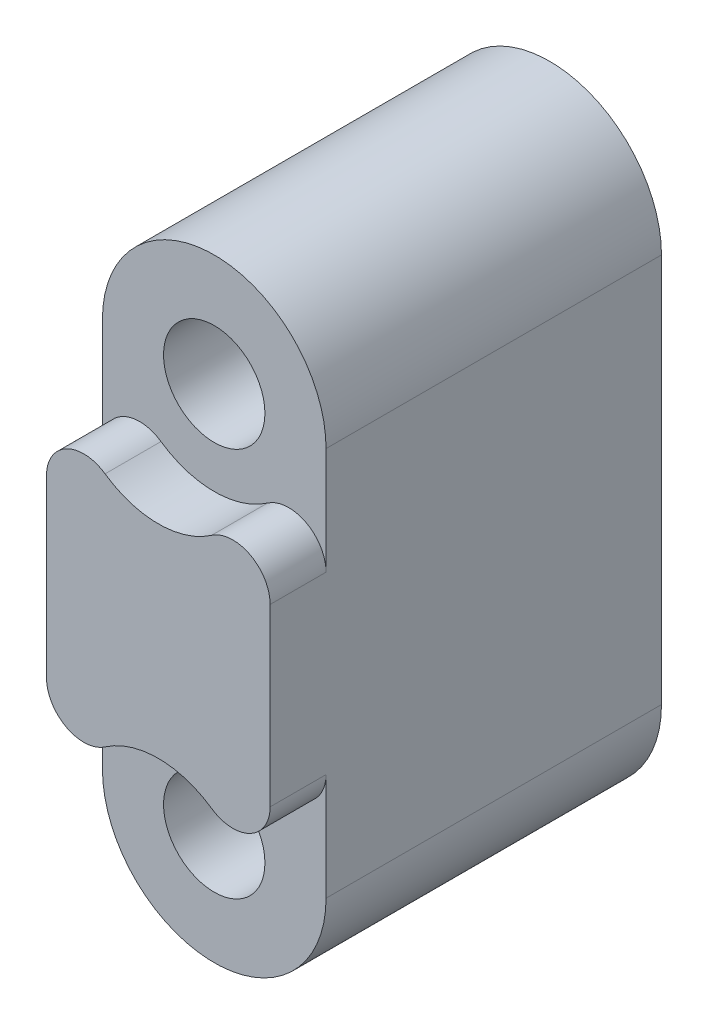
ISO-10303-21;
HEADER;
FILE_DESCRIPTION(('STEP AP214'),'2;1');
FILE_NAME('part.step','',(''),(''),'','','');
FILE_SCHEMA(('AUTOMOTIVE_DESIGN { 1 0 10303 214 1 1 1 1 }'));
ENDSEC;
DATA;
#1=APPLICATION_CONTEXT('core data for automotive mechanical design processes');
#2=APPLICATION_PROTOCOL_DEFINITION('international standard','automotive_design',2000,#1);
#3=PRODUCT_CONTEXT('',#1,'mechanical');
#4=PRODUCT('Part','Part','',(#3));
#5=PRODUCT_RELATED_PRODUCT_CATEGORY('part','',(#4));
#6=PRODUCT_DEFINITION_FORMATION('','',#4);
#7=PRODUCT_DEFINITION_CONTEXT('part definition',#1,'design');
#8=PRODUCT_DEFINITION('design','',#6,#7);
#9=PRODUCT_DEFINITION_SHAPE('','',#8);
#10=(LENGTH_UNIT() NAMED_UNIT(*) SI_UNIT(.MILLI.,.METRE.));
#11=(NAMED_UNIT(*) PLANE_ANGLE_UNIT() SI_UNIT($,.RADIAN.));
#12=(NAMED_UNIT(*) SI_UNIT($,.STERADIAN.) SOLID_ANGLE_UNIT());
#13=UNCERTAINTY_MEASURE_WITH_UNIT(LENGTH_MEASURE(1.E-05),#10,'distance_accuracy_value','');
#14=(GEOMETRIC_REPRESENTATION_CONTEXT(3) GLOBAL_UNCERTAINTY_ASSIGNED_CONTEXT((#13)) GLOBAL_UNIT_ASSIGNED_CONTEXT((#10,
#11,#12)) REPRESENTATION_CONTEXT('',''));
#15=CARTESIAN_POINT('',(0.,0.,0.));
#16=DIRECTION('',(0.,0.,1.));
#17=DIRECTION('',(1.,0.,0.));
#18=AXIS2_PLACEMENT_3D('',#15,#16,#17);
#19=CARTESIAN_POINT('',(0.,0.,14.2875));
#20=DIRECTION('',(0.,0.,1.));
#21=DIRECTION('',(1.,0.,0.));
#22=AXIS2_PLACEMENT_3D('',#19,#20,#21);
#23=PLANE('',#22);
#24=CARTESIAN_POINT('',(-3.175,12.0264533993104,14.2875));
#25=DIRECTION('',(0.,0.,1.));
#26=DIRECTION('',(1.,0.,0.));
#27=AXIS2_PLACEMENT_3D('',#24,#25,#26);
#28=CIRCLE('',#27,1.5875);
#29=CARTESIAN_POINT('',(-2.26785714285714,13.3292381423646,14.2875));
#30=VERTEX_POINT('',#29);
#31=CARTESIAN_POINT('',(-4.7625,12.0264533993104,14.2875));
#32=VERTEX_POINT('',#31);
#33=EDGE_CURVE('E53',#30,#32,#28,.T.);
#34=ORIENTED_EDGE('',*,*,#33,.F.);
#35=CARTESIAN_POINT('',(0.,16.5862,14.2875));
#36=DIRECTION('',(0.,0.,-1.));
#37=DIRECTION('',(1.,0.,0.));
#38=AXIS2_PLACEMENT_3D('',#35,#36,#37);
#39=CIRCLE('',#38,3.96875);
#40=CARTESIAN_POINT('',(2.26785714285714,13.3292381423646,14.2875));
#41=VERTEX_POINT('',#40);
#42=EDGE_CURVE('E59',#41,#30,#39,.T.);
#43=ORIENTED_EDGE('',*,*,#42,.F.);
#44=CARTESIAN_POINT('',(3.175,12.0264533993104,14.2875));
#45=DIRECTION('',(0.,0.,1.));
#46=DIRECTION('',(-1.,0.,0.));
#47=AXIS2_PLACEMENT_3D('',#44,#45,#46);
#48=CIRCLE('',#47,1.5875);
#49=CARTESIAN_POINT('',(4.7625,12.0264533993104,14.2875));
#50=VERTEX_POINT('',#49);
#51=EDGE_CURVE('E236',#50,#41,#48,.T.);
#52=ORIENTED_EDGE('',*,*,#51,.F.);
#53=DIRECTION('',(0.,1.,0.));
#54=VECTOR('',#53,1.);
#55=CARTESIAN_POINT('',(4.7625,0.,14.2875));
#56=LINE('',#55,#54);
#57=CARTESIAN_POINT('',(4.7625,16.5862,14.2875));
#58=VERTEX_POINT('',#57);
#59=EDGE_CURVE('E168',#50,#58,#56,.T.);
#60=ORIENTED_EDGE('',*,*,#59,.T.);
#61=CARTESIAN_POINT('',(0.,16.5862,14.2875));
#62=DIRECTION('',(0.,0.,1.));
#63=DIRECTION('',(1.,0.,0.));
#64=AXIS2_PLACEMENT_3D('',#61,#62,#63);
#65=CIRCLE('',#64,4.7625);
#66=CARTESIAN_POINT('',(-4.7625,16.5862,14.2875));
#67=VERTEX_POINT('',#66);
#68=EDGE_CURVE('E172',#58,#67,#65,.T.);
#69=ORIENTED_EDGE('',*,*,#68,.T.);
#70=DIRECTION('',(0.,-1.,0.));
#71=VECTOR('',#70,1.);
#72=CARTESIAN_POINT('',(-4.7625,0.,14.2875));
#73=LINE('',#72,#71);
#74=EDGE_CURVE('E180',#67,#32,#73,.T.);
#75=ORIENTED_EDGE('',*,*,#74,.T.);
#76=EDGE_LOOP('',(#34,#43,#52,#60,#69,#75));
#77=FACE_BOUND('',#76,.T.);
#78=CARTESIAN_POINT('',(0.,16.5862,14.2875));
#79=DIRECTION('',(0.,0.,1.));
#80=DIRECTION('',(1.,0.,0.));
#81=AXIS2_PLACEMENT_3D('',#78,#79,#80);
#82=CIRCLE('',#81,2.159);
#83=CARTESIAN_POINT('',(2.159,16.5862,14.2875));
#84=VERTEX_POINT('',#83);
#85=EDGE_CURVE('E165',#84,#84,#82,.T.);
#86=ORIENTED_EDGE('',*,*,#85,.F.);
#87=EDGE_LOOP('',(#86));
#88=FACE_BOUND('',#87,.T.);
#89=ADVANCED_FACE('F39',(#77,#88),#23,.T.);
#90=CARTESIAN_POINT('',(0.,0.,14.2875));
#91=DIRECTION('',(0.,0.,-1.));
#92=DIRECTION('',(-1.,0.,0.));
#93=AXIS2_PLACEMENT_3D('',#90,#91,#92);
#94=CYLINDRICAL_SURFACE('',#93,4.7625);
#95=CARTESIAN_POINT('',(0.,0.,0.));
#96=DIRECTION('',(0.,0.,1.));
#97=DIRECTION('',(1.,0.,0.));
#98=AXIS2_PLACEMENT_3D('',#95,#96,#97);
#99=CIRCLE('',#98,4.7625);
#100=CARTESIAN_POINT('',(-4.7625,0.,0.));
#101=VERTEX_POINT('',#100);
#102=CARTESIAN_POINT('',(4.7625,0.,0.));
#103=VERTEX_POINT('',#102);
#104=EDGE_CURVE('E161',#101,#103,#99,.T.);
#105=ORIENTED_EDGE('',*,*,#104,.T.);
#106=DIRECTION('',(0.,0.,-1.));
#107=VECTOR('',#106,1.);
#108=CARTESIAN_POINT('',(4.7625,0.,14.2875));
#109=LINE('',#108,#107);
#110=CARTESIAN_POINT('',(4.7625,0.,14.2875));
#111=VERTEX_POINT('',#110);
#112=EDGE_CURVE('E11',#111,#103,#109,.T.);
#113=ORIENTED_EDGE('',*,*,#112,.F.);
#114=CARTESIAN_POINT('',(0.,0.,14.2875));
#115=DIRECTION('',(0.,0.,1.));
#116=DIRECTION('',(1.,0.,0.));
#117=AXIS2_PLACEMENT_3D('',#114,#115,#116);
#118=CIRCLE('',#117,4.7625);
#119=CARTESIAN_POINT('',(-4.7625,0.,14.2875));
#120=VERTEX_POINT('',#119);
#121=EDGE_CURVE('E170',#120,#111,#118,.T.);
#122=ORIENTED_EDGE('',*,*,#121,.F.);
#123=DIRECTION('',(0.,0.,-1.));
#124=VECTOR('',#123,1.);
#125=CARTESIAN_POINT('',(-4.7625,0.,14.2875));
#126=LINE('',#125,#124);
#127=EDGE_CURVE('E179',#120,#101,#126,.T.);
#128=ORIENTED_EDGE('',*,*,#127,.T.);
#129=EDGE_LOOP('',(#105,#113,#122,#128));
#130=FACE_BOUND('',#129,.T.);
#131=ADVANCED_FACE('F41',(#130),#94,.T.);
#132=CARTESIAN_POINT('',(4.7625,0.,14.2875));
#133=DIRECTION('',(-1.,0.,0.));
#134=DIRECTION('',(0.,0.,1.));
#135=AXIS2_PLACEMENT_3D('',#132,#133,#134);
#136=PLANE('',#135);
#137=DIRECTION('',(0.,1.,0.));
#138=VECTOR('',#137,1.);
#139=CARTESIAN_POINT('',(4.7625,0.,0.));
#140=LINE('',#139,#138);
#141=CARTESIAN_POINT('',(4.7625,16.5862,0.));
#142=VERTEX_POINT('',#141);
#143=EDGE_CURVE('E185',#103,#142,#140,.T.);
#144=ORIENTED_EDGE('',*,*,#143,.T.);
#145=DIRECTION('',(0.,0.,-1.));
#146=VECTOR('',#145,1.);
#147=CARTESIAN_POINT('',(4.7625,16.5862,14.2875));
#148=LINE('',#147,#146);
#149=EDGE_CURVE('E50',#58,#142,#148,.T.);
#150=ORIENTED_EDGE('',*,*,#149,.F.);
#151=ORIENTED_EDGE('',*,*,#59,.F.);
#152=DIRECTION('',(0.,0.,-1.));
#153=VECTOR('',#152,1.);
#154=CARTESIAN_POINT('',(4.7625,12.0264533993104,16.66875));
#155=LINE('',#154,#153);
#156=CARTESIAN_POINT('',(4.7625,12.0264533993104,16.66875));
#157=VERTEX_POINT('',#156);
#158=EDGE_CURVE('E244',#157,#50,#155,.T.);
#159=ORIENTED_EDGE('',*,*,#158,.F.);
#160=DIRECTION('',(0.,1.,0.));
#161=VECTOR('',#160,1.);
#162=CARTESIAN_POINT('',(4.7625,12.0264533993104,16.66875));
#163=LINE('',#162,#161);
#164=CARTESIAN_POINT('',(4.76249999999999,4.55974660068956,16.66875));
#165=VERTEX_POINT('',#164);
#166=EDGE_CURVE('E223',#165,#157,#163,.T.);
#167=ORIENTED_EDGE('',*,*,#166,.F.);
#168=DIRECTION('',(0.,0.,-1.));
#169=VECTOR('',#168,1.);
#170=CARTESIAN_POINT('',(4.76249999999999,4.55974660068956,16.66875));
#171=LINE('',#170,#169);
#172=CARTESIAN_POINT('',(4.7625,4.55974660068956,14.2875));
#173=VERTEX_POINT('',#172);
#174=EDGE_CURVE('E248',#165,#173,#171,.T.);
#175=ORIENTED_EDGE('',*,*,#174,.T.);
#176=EDGE_CURVE('E175',#111,#173,#56,.T.);
#177=ORIENTED_EDGE('',*,*,#176,.F.);
#178=ORIENTED_EDGE('',*,*,#112,.T.);
#179=EDGE_LOOP('',(#144,#150,#151,#159,#167,#175,#177,#178));
#180=FACE_BOUND('',#179,.T.);
#181=ADVANCED_FACE('F265',(#180),#136,.F.);
#182=CARTESIAN_POINT('',(0.,16.5862,14.2875));
#183=DIRECTION('',(0.,0.,-1.));
#184=DIRECTION('',(-1.,0.,0.));
#185=AXIS2_PLACEMENT_3D('',#182,#183,#184);
#186=CYLINDRICAL_SURFACE('',#185,4.7625);
#187=CARTESIAN_POINT('',(0.,16.5862,0.));
#188=DIRECTION('',(0.,0.,1.));
#189=DIRECTION('',(1.,0.,0.));
#190=AXIS2_PLACEMENT_3D('',#187,#188,#189);
#191=CIRCLE('',#190,4.7625);
#192=CARTESIAN_POINT('',(-4.7625,16.5862,0.));
#193=VERTEX_POINT('',#192);
#194=EDGE_CURVE('E184',#142,#193,#191,.T.);
#195=ORIENTED_EDGE('',*,*,#194,.T.);
#196=DIRECTION('',(0.,0.,-1.));
#197=VECTOR('',#196,1.);
#198=CARTESIAN_POINT('',(-4.7625,16.5862,14.2875));
#199=LINE('',#198,#197);
#200=EDGE_CURVE('E187',#67,#193,#199,.T.);
#201=ORIENTED_EDGE('',*,*,#200,.F.);
#202=ORIENTED_EDGE('',*,*,#68,.F.);
#203=ORIENTED_EDGE('',*,*,#149,.T.);
#204=EDGE_LOOP('',(#195,#201,#202,#203));
#205=FACE_BOUND('',#204,.T.);
#206=ADVANCED_FACE('F198',(#205),#186,.T.);
#207=CARTESIAN_POINT('',(-4.7625,0.,14.2875));
#208=DIRECTION('',(1.,0.,0.));
#209=DIRECTION('',(0.,0.,-1.));
#210=AXIS2_PLACEMENT_3D('',#207,#208,#209);
#211=PLANE('',#210);
#212=DIRECTION('',(0.,-1.,0.));
#213=VECTOR('',#212,1.);
#214=CARTESIAN_POINT('',(-4.7625,0.,0.));
#215=LINE('',#214,#213);
#216=EDGE_CURVE('E173',#193,#101,#215,.T.);
#217=ORIENTED_EDGE('',*,*,#216,.T.);
#218=ORIENTED_EDGE('',*,*,#127,.F.);
#219=CARTESIAN_POINT('',(-4.7625,4.55974660068956,14.2875));
#220=VERTEX_POINT('',#219);
#221=EDGE_CURVE('E177',#220,#120,#73,.T.);
#222=ORIENTED_EDGE('',*,*,#221,.F.);
#223=DIRECTION('',(0.,0.,-1.));
#224=VECTOR('',#223,1.);
#225=CARTESIAN_POINT('',(-4.7625,4.55974660068956,16.66875));
#226=LINE('',#225,#224);
#227=CARTESIAN_POINT('',(-4.7625,4.55974660068956,16.66875));
#228=VERTEX_POINT('',#227);
#229=EDGE_CURVE('E132',#228,#220,#226,.T.);
#230=ORIENTED_EDGE('',*,*,#229,.F.);
#231=DIRECTION('',(0.,-1.,0.));
#232=VECTOR('',#231,1.);
#233=CARTESIAN_POINT('',(-4.7625,4.55974660068956,16.66875));
#234=LINE('',#233,#232);
#235=CARTESIAN_POINT('',(-4.7625,12.0264533993104,16.66875));
#236=VERTEX_POINT('',#235);
#237=EDGE_CURVE('E127',#236,#228,#234,.T.);
#238=ORIENTED_EDGE('',*,*,#237,.F.);
#239=DIRECTION('',(0.,0.,-1.));
#240=VECTOR('',#239,1.);
#241=CARTESIAN_POINT('',(-4.7625,12.0264533993104,16.66875));
#242=LINE('',#241,#240);
#243=EDGE_CURVE('E133',#236,#32,#242,.T.);
#244=ORIENTED_EDGE('',*,*,#243,.T.);
#245=ORIENTED_EDGE('',*,*,#74,.F.);
#246=ORIENTED_EDGE('',*,*,#200,.T.);
#247=EDGE_LOOP('',(#217,#218,#222,#230,#238,#244,#245,#246));
#248=FACE_BOUND('',#247,.T.);
#249=ADVANCED_FACE('F126',(#248),#211,.F.);
#250=CARTESIAN_POINT('',(3.17499999999999,4.55974660068956,14.2875));
#251=DIRECTION('',(0.,0.,1.));
#252=DIRECTION('',(1.,0.,0.));
#253=AXIS2_PLACEMENT_3D('',#250,#251,#252);
#254=CIRCLE('',#253,1.5875);
#255=CARTESIAN_POINT('',(2.26785714285714,3.2569618576354,14.2875));
#256=VERTEX_POINT('',#255);
#257=EDGE_CURVE('E237',#256,#173,#254,.T.);
#258=ORIENTED_EDGE('',*,*,#257,.F.);
#259=CARTESIAN_POINT('',(0.,0.,14.2875));
#260=DIRECTION('',(0.,0.,-1.));
#261=DIRECTION('',(-1.,0.,0.));
#262=AXIS2_PLACEMENT_3D('',#259,#260,#261);
#263=CIRCLE('',#262,3.96875);
#264=CARTESIAN_POINT('',(-2.26785714285715,3.2569618576354,14.2875));
#265=VERTEX_POINT('',#264);
#266=EDGE_CURVE('E233',#265,#256,#263,.T.);
#267=ORIENTED_EDGE('',*,*,#266,.F.);
#268=CARTESIAN_POINT('',(-3.175,4.55974660068956,14.2875));
#269=DIRECTION('',(0.,0.,1.));
#270=DIRECTION('',(-1.,0.,0.));
#271=AXIS2_PLACEMENT_3D('',#268,#269,#270);
#272=CIRCLE('',#271,1.5875);
#273=EDGE_CURVE('E213',#220,#265,#272,.T.);
#274=ORIENTED_EDGE('',*,*,#273,.F.);
#275=ORIENTED_EDGE('',*,*,#221,.T.);
#276=ORIENTED_EDGE('',*,*,#121,.T.);
#277=ORIENTED_EDGE('',*,*,#176,.T.);
#278=EDGE_LOOP('',(#258,#267,#274,#275,#276,#277));
#279=FACE_BOUND('',#278,.T.);
#280=CARTESIAN_POINT('',(0.,0.,14.2875));
#281=DIRECTION('',(0.,0.,1.));
#282=DIRECTION('',(1.,0.,0.));
#283=AXIS2_PLACEMENT_3D('',#280,#281,#282);
#284=CIRCLE('',#283,2.159);
#285=CARTESIAN_POINT('',(2.159,0.,14.2875));
#286=VERTEX_POINT('',#285);
#287=EDGE_CURVE('E155',#286,#286,#284,.T.);
#288=ORIENTED_EDGE('',*,*,#287,.F.);
#289=EDGE_LOOP('',(#288));
#290=FACE_BOUND('',#289,.T.);
#291=ADVANCED_FACE('F207',(#279,#290),#23,.T.);
#292=CARTESIAN_POINT('',(0.,0.,0.));
#293=DIRECTION('',(0.,0.,1.));
#294=DIRECTION('',(1.,0.,0.));
#295=AXIS2_PLACEMENT_3D('',#292,#293,#294);
#296=PLANE('',#295);
#297=CARTESIAN_POINT('',(0.,16.5862,0.));
#298=DIRECTION('',(0.,0.,1.));
#299=DIRECTION('',(1.,0.,0.));
#300=AXIS2_PLACEMENT_3D('',#297,#298,#299);
#301=CIRCLE('',#300,2.159);
#302=CARTESIAN_POINT('',(2.159,16.5862,0.));
#303=VERTEX_POINT('',#302);
#304=EDGE_CURVE('E158',#303,#303,#301,.T.);
#305=ORIENTED_EDGE('',*,*,#304,.T.);
#306=EDGE_LOOP('',(#305));
#307=FACE_BOUND('',#306,.T.);
#308=CARTESIAN_POINT('',(0.,0.,0.));
#309=DIRECTION('',(0.,0.,1.));
#310=DIRECTION('',(1.,0.,0.));
#311=AXIS2_PLACEMENT_3D('',#308,#309,#310);
#312=CIRCLE('',#311,2.159);
#313=CARTESIAN_POINT('',(2.159,0.,0.));
#314=VERTEX_POINT('',#313);
#315=EDGE_CURVE('E149',#314,#314,#312,.T.);
#316=ORIENTED_EDGE('',*,*,#315,.T.);
#317=EDGE_LOOP('',(#316));
#318=FACE_BOUND('',#317,.T.);
#319=ORIENTED_EDGE('',*,*,#104,.F.);
#320=ORIENTED_EDGE('',*,*,#216,.F.);
#321=ORIENTED_EDGE('',*,*,#194,.F.);
#322=ORIENTED_EDGE('',*,*,#143,.F.);
#323=EDGE_LOOP('',(#319,#320,#321,#322));
#324=FACE_BOUND('',#323,.T.);
#325=ADVANCED_FACE('F201',(#307,#318,#324),#296,.F.);
#326=CARTESIAN_POINT('',(0.,0.,0.));
#327=DIRECTION('',(0.,0.,1.));
#328=DIRECTION('',(1.,0.,0.));
#329=AXIS2_PLACEMENT_3D('',#326,#327,#328);
#330=CYLINDRICAL_SURFACE('',#329,2.159);
#331=ORIENTED_EDGE('',*,*,#315,.F.);
#332=EDGE_LOOP('',(#331));
#333=FACE_BOUND('',#332,.T.);
#334=ORIENTED_EDGE('',*,*,#287,.T.);
#335=EDGE_LOOP('',(#334));
#336=FACE_BOUND('',#335,.T.);
#337=ADVANCED_FACE('F291',(#333,#336),#330,.F.);
#338=CARTESIAN_POINT('',(0.,16.5862,0.));
#339=DIRECTION('',(0.,0.,1.));
#340=DIRECTION('',(1.,0.,0.));
#341=AXIS2_PLACEMENT_3D('',#338,#339,#340);
#342=CYLINDRICAL_SURFACE('',#341,2.159);
#343=ORIENTED_EDGE('',*,*,#304,.F.);
#344=EDGE_LOOP('',(#343));
#345=FACE_BOUND('',#344,.T.);
#346=ORIENTED_EDGE('',*,*,#85,.T.);
#347=EDGE_LOOP('',(#346));
#348=FACE_BOUND('',#347,.T.);
#349=ADVANCED_FACE('F324',(#345,#348),#342,.F.);
#350=CARTESIAN_POINT('',(-3.175,12.0264533993104,16.66875));
#351=DIRECTION('',(0.,0.,-1.));
#352=DIRECTION('',(-1.,0.,0.));
#353=AXIS2_PLACEMENT_3D('',#350,#351,#352);
#354=CYLINDRICAL_SURFACE('',#353,1.5875);
#355=ORIENTED_EDGE('',*,*,#33,.T.);
#356=ORIENTED_EDGE('',*,*,#243,.F.);
#357=CARTESIAN_POINT('',(-3.175,12.0264533993104,16.66875));
#358=DIRECTION('',(0.,0.,1.));
#359=DIRECTION('',(1.,0.,0.));
#360=AXIS2_PLACEMENT_3D('',#357,#358,#359);
#361=CIRCLE('',#360,1.5875);
#362=CARTESIAN_POINT('',(-2.26785714285714,13.3292381423646,16.66875));
#363=VERTEX_POINT('',#362);
#364=EDGE_CURVE('E138',#363,#236,#361,.T.);
#365=ORIENTED_EDGE('',*,*,#364,.F.);
#366=DIRECTION('',(0.,0.,-1.));
#367=VECTOR('',#366,1.);
#368=CARTESIAN_POINT('',(-2.26785714285714,13.3292381423646,16.66875));
#369=LINE('',#368,#367);
#370=EDGE_CURVE('E229',#363,#30,#369,.T.);
#371=ORIENTED_EDGE('',*,*,#370,.T.);
#372=EDGE_LOOP('',(#355,#356,#365,#371));
#373=FACE_BOUND('',#372,.T.);
#374=ADVANCED_FACE('F146',(#373),#354,.T.);
#375=CARTESIAN_POINT('',(-3.175,4.55974660068956,16.66875));
#376=DIRECTION('',(0.,0.,-1.));
#377=DIRECTION('',(-1.,0.,0.));
#378=AXIS2_PLACEMENT_3D('',#375,#376,#377);
#379=CYLINDRICAL_SURFACE('',#378,1.5875);
#380=ORIENTED_EDGE('',*,*,#273,.T.);
#381=DIRECTION('',(0.,0.,-1.));
#382=VECTOR('',#381,1.);
#383=CARTESIAN_POINT('',(-2.26785714285715,3.2569618576354,16.66875));
#384=LINE('',#383,#382);
#385=CARTESIAN_POINT('',(-2.26785714285715,3.2569618576354,16.66875));
#386=VERTEX_POINT('',#385);
#387=EDGE_CURVE('E152',#386,#265,#384,.T.);
#388=ORIENTED_EDGE('',*,*,#387,.F.);
#389=CARTESIAN_POINT('',(-3.175,4.55974660068956,16.66875));
#390=DIRECTION('',(0.,0.,1.));
#391=DIRECTION('',(-1.,0.,0.));
#392=AXIS2_PLACEMENT_3D('',#389,#390,#391);
#393=CIRCLE('',#392,1.5875);
#394=EDGE_CURVE('E140',#228,#386,#393,.T.);
#395=ORIENTED_EDGE('',*,*,#394,.F.);
#396=ORIENTED_EDGE('',*,*,#229,.T.);
#397=EDGE_LOOP('',(#380,#388,#395,#396));
#398=FACE_BOUND('',#397,.T.);
#399=ADVANCED_FACE('F214',(#398),#379,.T.);
#400=CARTESIAN_POINT('',(0.,0.,16.66875));
#401=DIRECTION('',(0.,0.,-1.));
#402=DIRECTION('',(-1.,0.,0.));
#403=AXIS2_PLACEMENT_3D('',#400,#401,#402);
#404=CYLINDRICAL_SURFACE('',#403,3.96875);
#405=ORIENTED_EDGE('',*,*,#266,.T.);
#406=DIRECTION('',(0.,0.,-1.));
#407=VECTOR('',#406,1.);
#408=CARTESIAN_POINT('',(2.26785714285714,3.2569618576354,16.66875));
#409=LINE('',#408,#407);
#410=CARTESIAN_POINT('',(2.26785714285714,3.2569618576354,16.66875));
#411=VERTEX_POINT('',#410);
#412=EDGE_CURVE('E253',#411,#256,#409,.T.);
#413=ORIENTED_EDGE('',*,*,#412,.F.);
#414=CARTESIAN_POINT('',(0.,0.,16.66875));
#415=DIRECTION('',(0.,0.,-1.));
#416=DIRECTION('',(-1.,0.,0.));
#417=AXIS2_PLACEMENT_3D('',#414,#415,#416);
#418=CIRCLE('',#417,3.96875);
#419=EDGE_CURVE('E218',#386,#411,#418,.T.);
#420=ORIENTED_EDGE('',*,*,#419,.F.);
#421=ORIENTED_EDGE('',*,*,#387,.T.);
#422=EDGE_LOOP('',(#405,#413,#420,#421));
#423=FACE_BOUND('',#422,.T.);
#424=ADVANCED_FACE('F255',(#423),#404,.F.);
#425=CARTESIAN_POINT('',(3.17499999999999,4.55974660068956,16.66875));
#426=DIRECTION('',(0.,0.,-1.));
#427=DIRECTION('',(-1.,0.,0.));
#428=AXIS2_PLACEMENT_3D('',#425,#426,#427);
#429=CYLINDRICAL_SURFACE('',#428,1.5875);
#430=ORIENTED_EDGE('',*,*,#257,.T.);
#431=ORIENTED_EDGE('',*,*,#174,.F.);
#432=CARTESIAN_POINT('',(3.17499999999999,4.55974660068956,16.66875));
#433=DIRECTION('',(0.,0.,1.));
#434=DIRECTION('',(1.,0.,0.));
#435=AXIS2_PLACEMENT_3D('',#432,#433,#434);
#436=CIRCLE('',#435,1.5875);
#437=EDGE_CURVE('E222',#411,#165,#436,.T.);
#438=ORIENTED_EDGE('',*,*,#437,.F.);
#439=ORIENTED_EDGE('',*,*,#412,.T.);
#440=EDGE_LOOP('',(#430,#431,#438,#439));
#441=FACE_BOUND('',#440,.T.);
#442=ADVANCED_FACE('F261',(#441),#429,.T.);
#443=CARTESIAN_POINT('',(3.175,12.0264533993104,16.66875));
#444=DIRECTION('',(0.,0.,-1.));
#445=DIRECTION('',(-1.,0.,0.));
#446=AXIS2_PLACEMENT_3D('',#443,#444,#445);
#447=CYLINDRICAL_SURFACE('',#446,1.5875);
#448=ORIENTED_EDGE('',*,*,#51,.T.);
#449=DIRECTION('',(0.,0.,-1.));
#450=VECTOR('',#449,1.);
#451=CARTESIAN_POINT('',(2.26785714285714,13.3292381423646,16.66875));
#452=LINE('',#451,#450);
#453=CARTESIAN_POINT('',(2.26785714285714,13.3292381423646,16.66875));
#454=VERTEX_POINT('',#453);
#455=EDGE_CURVE('E245',#454,#41,#452,.T.);
#456=ORIENTED_EDGE('',*,*,#455,.F.);
#457=CARTESIAN_POINT('',(3.175,12.0264533993104,16.66875));
#458=DIRECTION('',(0.,0.,1.));
#459=DIRECTION('',(-1.,0.,0.));
#460=AXIS2_PLACEMENT_3D('',#457,#458,#459);
#461=CIRCLE('',#460,1.5875);
#462=EDGE_CURVE('E230',#157,#454,#461,.T.);
#463=ORIENTED_EDGE('',*,*,#462,.F.);
#464=ORIENTED_EDGE('',*,*,#158,.T.);
#465=EDGE_LOOP('',(#448,#456,#463,#464));
#466=FACE_BOUND('',#465,.T.);
#467=ADVANCED_FACE('F266',(#466),#447,.T.);
#468=CARTESIAN_POINT('',(0.,16.5862,16.66875));
#469=DIRECTION('',(0.,0.,-1.));
#470=DIRECTION('',(-1.,0.,0.));
#471=AXIS2_PLACEMENT_3D('',#468,#469,#470);
#472=CYLINDRICAL_SURFACE('',#471,3.96875);
#473=ORIENTED_EDGE('',*,*,#42,.T.);
#474=ORIENTED_EDGE('',*,*,#370,.F.);
#475=CARTESIAN_POINT('',(0.,16.5862,16.66875));
#476=DIRECTION('',(0.,0.,-1.));
#477=DIRECTION('',(1.,0.,0.));
#478=AXIS2_PLACEMENT_3D('',#475,#476,#477);
#479=CIRCLE('',#478,3.96875);
#480=EDGE_CURVE('E141',#454,#363,#479,.T.);
#481=ORIENTED_EDGE('',*,*,#480,.F.);
#482=ORIENTED_EDGE('',*,*,#455,.T.);
#483=EDGE_LOOP('',(#473,#474,#481,#482));
#484=FACE_BOUND('',#483,.T.);
#485=ADVANCED_FACE('F268',(#484),#472,.F.);
#486=CARTESIAN_POINT('',(-3.175,12.0264533993104,16.66875));
#487=DIRECTION('',(0.,0.,1.));
#488=DIRECTION('',(1.,0.,0.));
#489=AXIS2_PLACEMENT_3D('',#486,#487,#488);
#490=PLANE('',#489);
#491=ORIENTED_EDGE('',*,*,#364,.T.);
#492=ORIENTED_EDGE('',*,*,#237,.T.);
#493=ORIENTED_EDGE('',*,*,#394,.T.);
#494=ORIENTED_EDGE('',*,*,#419,.T.);
#495=ORIENTED_EDGE('',*,*,#437,.T.);
#496=ORIENTED_EDGE('',*,*,#166,.T.);
#497=ORIENTED_EDGE('',*,*,#462,.T.);
#498=ORIENTED_EDGE('',*,*,#480,.T.);
#499=EDGE_LOOP('',(#491,#492,#493,#494,#495,#496,#497,#498));
#500=FACE_BOUND('',#499,.T.);
#501=ADVANCED_FACE('F143',(#500),#490,.T.);
#502=CLOSED_SHELL('',(#89,#131,#181,#206,#249,#291,#325,#337,#349,#374,#399,#424,#442,#467,#485,#501));
#503=MANIFOLD_SOLID_BREP('B2',#502);
#504=ADVANCED_BREP_SHAPE_REPRESENTATION('',(#18,#503),#14);
#505=SHAPE_DEFINITION_REPRESENTATION(#9,#504);
ENDSEC;
END-ISO-10303-21;
